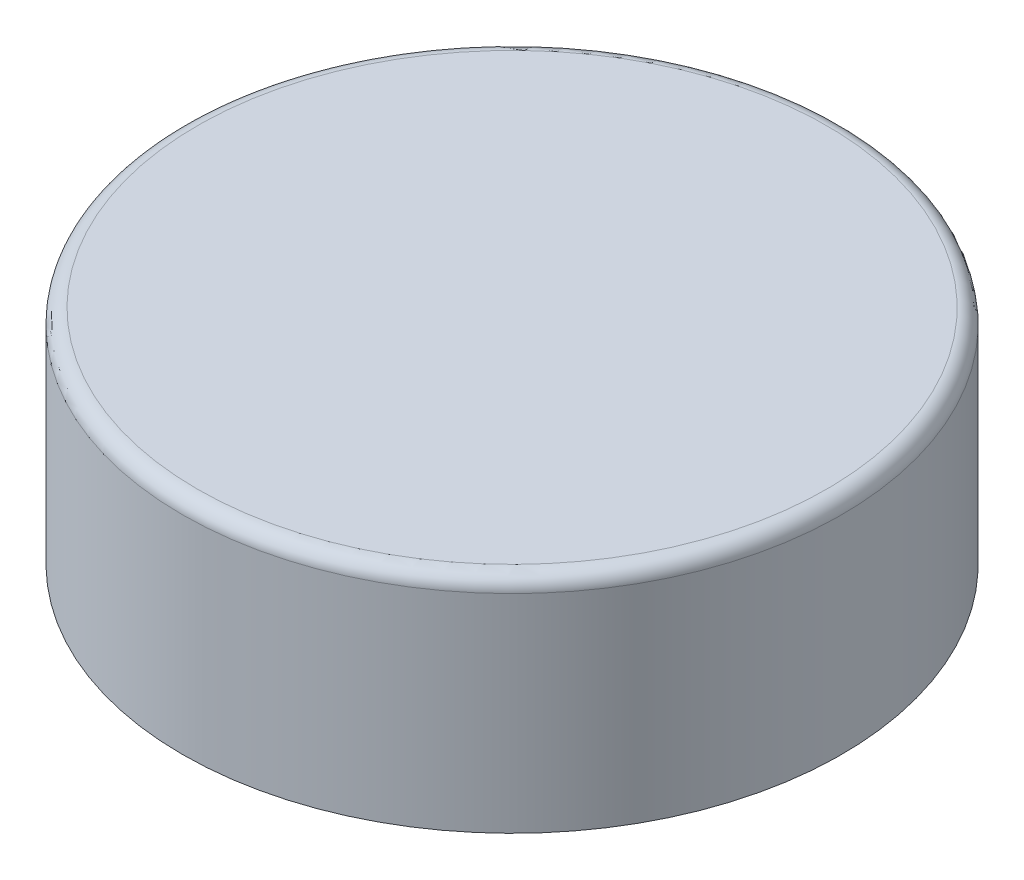
ISO-10303-21;
HEADER;
FILE_DESCRIPTION(('STEP AP214'),'2;1');
FILE_NAME('part.step','',(''),(''),'','','');
FILE_SCHEMA(('AUTOMOTIVE_DESIGN { 1 0 10303 214 1 1 1 1 }'));
ENDSEC;
DATA;
#1=APPLICATION_CONTEXT('core data for automotive mechanical design processes');
#2=APPLICATION_PROTOCOL_DEFINITION('international standard','automotive_design',2000,#1);
#3=PRODUCT_CONTEXT('',#1,'mechanical');
#4=PRODUCT('Part','Part','',(#3));
#5=PRODUCT_RELATED_PRODUCT_CATEGORY('part','',(#4));
#6=PRODUCT_DEFINITION_FORMATION('','',#4);
#7=PRODUCT_DEFINITION_CONTEXT('part definition',#1,'design');
#8=PRODUCT_DEFINITION('design','',#6,#7);
#9=PRODUCT_DEFINITION_SHAPE('','',#8);
#10=(LENGTH_UNIT() NAMED_UNIT(*) SI_UNIT(.MILLI.,.METRE.));
#11=(NAMED_UNIT(*) PLANE_ANGLE_UNIT() SI_UNIT($,.RADIAN.));
#12=(NAMED_UNIT(*) SI_UNIT($,.STERADIAN.) SOLID_ANGLE_UNIT());
#13=UNCERTAINTY_MEASURE_WITH_UNIT(LENGTH_MEASURE(1.E-05),#10,'distance_accuracy_value','');
#14=(GEOMETRIC_REPRESENTATION_CONTEXT(3) GLOBAL_UNCERTAINTY_ASSIGNED_CONTEXT((#13)) GLOBAL_UNIT_ASSIGNED_CONTEXT((#10,
#11,#12)) REPRESENTATION_CONTEXT('',''));
#15=CARTESIAN_POINT('',(0.,0.,0.));
#16=DIRECTION('',(0.,0.,1.));
#17=DIRECTION('',(1.,0.,0.));
#18=AXIS2_PLACEMENT_3D('',#15,#16,#17);
#19=CARTESIAN_POINT('',(0.,14.,0.));
#20=DIRECTION('',(0.,1.,0.));
#21=DIRECTION('',(0.,0.,1.));
#22=AXIS2_PLACEMENT_3D('',#19,#20,#21);
#23=TOROIDAL_SURFACE('',#22,21.225,1.);
#24=CARTESIAN_POINT('',(0.,15.,0.));
#25=DIRECTION('',(0.,1.,0.));
#26=DIRECTION('',(0.,0.,1.));
#27=AXIS2_PLACEMENT_3D('',#24,#25,#26);
#28=CIRCLE('',#27,21.225);
#29=CARTESIAN_POINT('',(0.,15.,21.225));
#30=VERTEX_POINT('',#29);
#31=EDGE_CURVE('E58',#30,#30,#28,.T.);
#32=ORIENTED_EDGE('',*,*,#31,.F.);
#33=EDGE_LOOP('',(#32));
#34=FACE_BOUND('',#33,.T.);
#35=CARTESIAN_POINT('',(0.,14.,0.));
#36=DIRECTION('',(0.,-1.,0.));
#37=DIRECTION('',(0.,0.,1.));
#38=AXIS2_PLACEMENT_3D('',#35,#36,#37);
#39=CIRCLE('',#38,22.225);
#40=CARTESIAN_POINT('',(0.,14.,22.225));
#41=VERTEX_POINT('',#40);
#42=EDGE_CURVE('E68',#41,#41,#39,.T.);
#43=ORIENTED_EDGE('',*,*,#42,.F.);
#44=EDGE_LOOP('',(#43));
#45=FACE_BOUND('',#44,.T.);
#46=ADVANCED_FACE('F17',(#34,#45),#23,.T.);
#47=CARTESIAN_POINT('',(0.,8.,0.));
#48=DIRECTION('',(0.,-1.,0.));
#49=DIRECTION('',(0.,0.,-1.));
#50=AXIS2_PLACEMENT_3D('',#47,#48,#49);
#51=PLANE('',#50);
#52=CARTESIAN_POINT('',(0.,8.,0.));
#53=DIRECTION('',(0.,-1.,0.));
#54=DIRECTION('',(0.,0.,-1.));
#55=AXIS2_PLACEMENT_3D('',#52,#53,#54);
#56=CIRCLE('',#55,18.725);
#57=CARTESIAN_POINT('',(0.,8.,-18.725));
#58=VERTEX_POINT('',#57);
#59=EDGE_CURVE('E11',#58,#58,#56,.T.);
#60=ORIENTED_EDGE('',*,*,#59,.T.);
#61=EDGE_LOOP('',(#60));
#62=FACE_BOUND('',#61,.T.);
#63=ADVANCED_FACE('F124',(#62),#51,.T.);
#64=CARTESIAN_POINT('',(0.,8.,0.));
#65=DIRECTION('',(0.,-1.,0.));
#66=DIRECTION('',(0.,0.,-1.));
#67=AXIS2_PLACEMENT_3D('',#64,#65,#66);
#68=CYLINDRICAL_SURFACE('',#67,18.725);
#69=ORIENTED_EDGE('',*,*,#59,.F.);
#70=EDGE_LOOP('',(#69));
#71=FACE_BOUND('',#70,.T.);
#72=CARTESIAN_POINT('',(0.,0.,0.));
#73=DIRECTION('',(0.,-1.,0.));
#74=DIRECTION('',(0.,0.,-1.));
#75=AXIS2_PLACEMENT_3D('',#72,#73,#74);
#76=CIRCLE('',#75,18.725);
#77=CARTESIAN_POINT('',(0.,0.,-18.725));
#78=VERTEX_POINT('',#77);
#79=EDGE_CURVE('E20',#78,#78,#76,.T.);
#80=ORIENTED_EDGE('',*,*,#79,.T.);
#81=EDGE_LOOP('',(#80));
#82=FACE_BOUND('',#81,.T.);
#83=ADVANCED_FACE('F115',(#71,#82),#68,.F.);
#84=CARTESIAN_POINT('',(0.,0.,0.));
#85=DIRECTION('',(0.,1.,0.));
#86=DIRECTION('',(1.,0.,0.));
#87=AXIS2_PLACEMENT_3D('',#84,#85,#86);
#88=PLANE('',#87);
#89=ORIENTED_EDGE('',*,*,#79,.F.);
#90=EDGE_LOOP('',(#89));
#91=FACE_BOUND('',#90,.T.);
#92=CARTESIAN_POINT('',(0.,0.,0.));
#93=DIRECTION('',(0.,1.,0.));
#94=DIRECTION('',(0.,0.,1.));
#95=AXIS2_PLACEMENT_3D('',#92,#93,#94);
#96=CIRCLE('',#95,22.225);
#97=CARTESIAN_POINT('',(0.,0.,22.225));
#98=VERTEX_POINT('',#97);
#99=EDGE_CURVE('E62',#98,#98,#96,.T.);
#100=ORIENTED_EDGE('',*,*,#99,.F.);
#101=EDGE_LOOP('',(#100));
#102=FACE_BOUND('',#101,.T.);
#103=ADVANCED_FACE('F104',(#91,#102),#88,.F.);
#104=CARTESIAN_POINT('',(0.,10.,0.));
#105=DIRECTION('',(0.,-1.,0.));
#106=DIRECTION('',(0.,0.,-1.));
#107=AXIS2_PLACEMENT_3D('',#104,#105,#106);
#108=CYLINDRICAL_SURFACE('',#107,22.225);
#109=ORIENTED_EDGE('',*,*,#42,.T.);
#110=EDGE_LOOP('',(#109));
#111=FACE_BOUND('',#110,.T.);
#112=ORIENTED_EDGE('',*,*,#99,.T.);
#113=EDGE_LOOP('',(#112));
#114=FACE_BOUND('',#113,.T.);
#115=ADVANCED_FACE('F92',(#111,#114),#108,.T.);
#116=CARTESIAN_POINT('',(0.,15.,0.));
#117=DIRECTION('',(0.,1.,0.));
#118=DIRECTION('',(1.,0.,0.));
#119=AXIS2_PLACEMENT_3D('',#116,#117,#118);
#120=PLANE('',#119);
#121=ORIENTED_EDGE('',*,*,#31,.T.);
#122=EDGE_LOOP('',(#121));
#123=FACE_BOUND('',#122,.T.);
#124=ADVANCED_FACE('F59',(#123),#120,.T.);
#125=CLOSED_SHELL('',(#46,#63,#83,#103,#115,#124));
#126=MANIFOLD_SOLID_BREP('B1',#125);
#127=ADVANCED_BREP_SHAPE_REPRESENTATION('',(#18,#126),#14);
#128=SHAPE_DEFINITION_REPRESENTATION(#9,#127);
ENDSEC;
END-ISO-10303-21;
